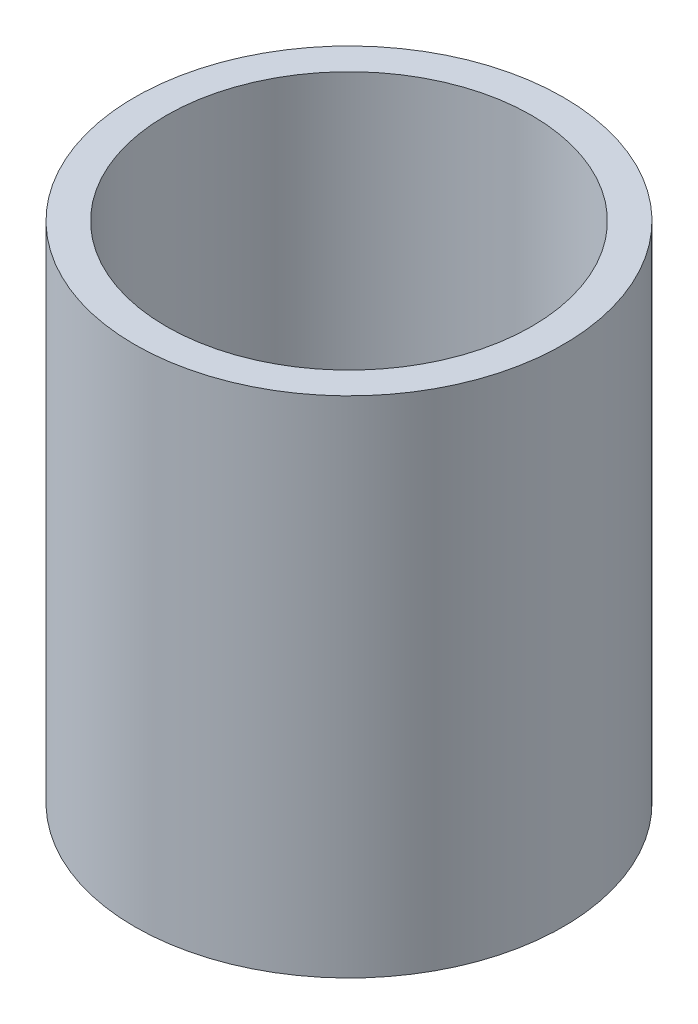
ISO-10303-21;
HEADER;
FILE_DESCRIPTION(('STEP AP214'),'2;1');
FILE_NAME('part.step','',(''),(''),'','','');
FILE_SCHEMA(('AUTOMOTIVE_DESIGN { 1 0 10303 214 1 1 1 1 }'));
ENDSEC;
DATA;
#1=APPLICATION_CONTEXT('core data for automotive mechanical design processes');
#2=APPLICATION_PROTOCOL_DEFINITION('international standard','automotive_design',2000,#1);
#3=PRODUCT_CONTEXT('',#1,'mechanical');
#4=PRODUCT('Part','Part','',(#3));
#5=PRODUCT_RELATED_PRODUCT_CATEGORY('part','',(#4));
#6=PRODUCT_DEFINITION_FORMATION('','',#4);
#7=PRODUCT_DEFINITION_CONTEXT('part definition',#1,'design');
#8=PRODUCT_DEFINITION('design','',#6,#7);
#9=PRODUCT_DEFINITION_SHAPE('','',#8);
#10=(LENGTH_UNIT() NAMED_UNIT(*) SI_UNIT(.MILLI.,.METRE.));
#11=(NAMED_UNIT(*) PLANE_ANGLE_UNIT() SI_UNIT($,.RADIAN.));
#12=(NAMED_UNIT(*) SI_UNIT($,.STERADIAN.) SOLID_ANGLE_UNIT());
#13=UNCERTAINTY_MEASURE_WITH_UNIT(LENGTH_MEASURE(1.E-05),#10,'distance_accuracy_value','');
#14=(GEOMETRIC_REPRESENTATION_CONTEXT(3) GLOBAL_UNCERTAINTY_ASSIGNED_CONTEXT((#13)) GLOBAL_UNIT_ASSIGNED_CONTEXT((#10,
#11,#12)) REPRESENTATION_CONTEXT('',''));
#15=CARTESIAN_POINT('',(0.,0.,0.));
#16=DIRECTION('',(0.,0.,1.));
#17=DIRECTION('',(1.,0.,0.));
#18=AXIS2_PLACEMENT_3D('',#15,#16,#17);
#19=CARTESIAN_POINT('',(0.,101.6,0.));
#20=DIRECTION('',(0.,1.,0.));
#21=DIRECTION('',(0.,0.,1.));
#22=AXIS2_PLACEMENT_3D('',#19,#20,#21);
#23=PLANE('',#22);
#24=CARTESIAN_POINT('',(0.,101.6,0.));
#25=DIRECTION('',(0.,1.,0.));
#26=DIRECTION('',(0.,0.,1.));
#27=AXIS2_PLACEMENT_3D('',#24,#25,#26);
#28=CIRCLE('',#27,43.18);
#29=CARTESIAN_POINT('',(0.,101.6,43.18));
#30=VERTEX_POINT('',#29);
#31=EDGE_CURVE('E10',#30,#30,#28,.T.);
#32=ORIENTED_EDGE('',*,*,#31,.T.);
#33=EDGE_LOOP('',(#32));
#34=FACE_BOUND('',#33,.T.);
#35=CARTESIAN_POINT('',(0.,101.6,0.));
#36=DIRECTION('',(0.,1.,0.));
#37=DIRECTION('',(0.,0.,1.));
#38=AXIS2_PLACEMENT_3D('',#35,#36,#37);
#39=CIRCLE('',#38,36.83);
#40=CARTESIAN_POINT('',(0.,101.6,36.83));
#41=VERTEX_POINT('',#40);
#42=EDGE_CURVE('E42',#41,#41,#39,.T.);
#43=ORIENTED_EDGE('',*,*,#42,.F.);
#44=EDGE_LOOP('',(#43));
#45=FACE_BOUND('',#44,.T.);
#46=ADVANCED_FACE('F31',(#34,#45),#23,.T.);
#47=CARTESIAN_POINT('',(0.,0.,0.));
#48=DIRECTION('',(0.,1.,0.));
#49=DIRECTION('',(0.,0.,1.));
#50=AXIS2_PLACEMENT_3D('',#47,#48,#49);
#51=PLANE('',#50);
#52=CARTESIAN_POINT('',(0.,0.,0.));
#53=DIRECTION('',(0.,1.,0.));
#54=DIRECTION('',(0.,0.,1.));
#55=AXIS2_PLACEMENT_3D('',#52,#53,#54);
#56=CIRCLE('',#55,43.18);
#57=CARTESIAN_POINT('',(0.,0.,43.18));
#58=VERTEX_POINT('',#57);
#59=EDGE_CURVE('E35',#58,#58,#56,.T.);
#60=ORIENTED_EDGE('',*,*,#59,.F.);
#61=EDGE_LOOP('',(#60));
#62=FACE_BOUND('',#61,.T.);
#63=CARTESIAN_POINT('',(0.,0.,0.));
#64=DIRECTION('',(0.,1.,0.));
#65=DIRECTION('',(0.,0.,1.));
#66=AXIS2_PLACEMENT_3D('',#63,#64,#65);
#67=CIRCLE('',#66,36.83);
#68=CARTESIAN_POINT('',(0.,0.,36.83));
#69=VERTEX_POINT('',#68);
#70=EDGE_CURVE('E44',#69,#69,#67,.T.);
#71=ORIENTED_EDGE('',*,*,#70,.T.);
#72=EDGE_LOOP('',(#71));
#73=FACE_BOUND('',#72,.T.);
#74=ADVANCED_FACE('F54',(#62,#73),#51,.F.);
#75=CARTESIAN_POINT('',(0.,101.6,0.));
#76=DIRECTION('',(0.,-1.,0.));
#77=DIRECTION('',(0.,0.,-1.));
#78=AXIS2_PLACEMENT_3D('',#75,#76,#77);
#79=CYLINDRICAL_SURFACE('',#78,43.18);
#80=ORIENTED_EDGE('',*,*,#31,.F.);
#81=EDGE_LOOP('',(#80));
#82=FACE_BOUND('',#81,.T.);
#83=ORIENTED_EDGE('',*,*,#59,.T.);
#84=EDGE_LOOP('',(#83));
#85=FACE_BOUND('',#84,.T.);
#86=ADVANCED_FACE('F33',(#82,#85),#79,.T.);
#87=CARTESIAN_POINT('',(0.,101.6,0.));
#88=DIRECTION('',(0.,-1.,0.));
#89=DIRECTION('',(0.,0.,-1.));
#90=AXIS2_PLACEMENT_3D('',#87,#88,#89);
#91=CYLINDRICAL_SURFACE('',#90,36.83);
#92=ORIENTED_EDGE('',*,*,#42,.T.);
#93=EDGE_LOOP('',(#92));
#94=FACE_BOUND('',#93,.T.);
#95=ORIENTED_EDGE('',*,*,#70,.F.);
#96=EDGE_LOOP('',(#95));
#97=FACE_BOUND('',#96,.T.);
#98=ADVANCED_FACE('F50',(#94,#97),#91,.F.);
#99=CLOSED_SHELL('',(#46,#74,#86,#98));
#100=MANIFOLD_SOLID_BREP('B2',#99);
#101=ADVANCED_BREP_SHAPE_REPRESENTATION('',(#18,#100),#14);
#102=SHAPE_DEFINITION_REPRESENTATION(#9,#101);
ENDSEC;
END-ISO-10303-21;
